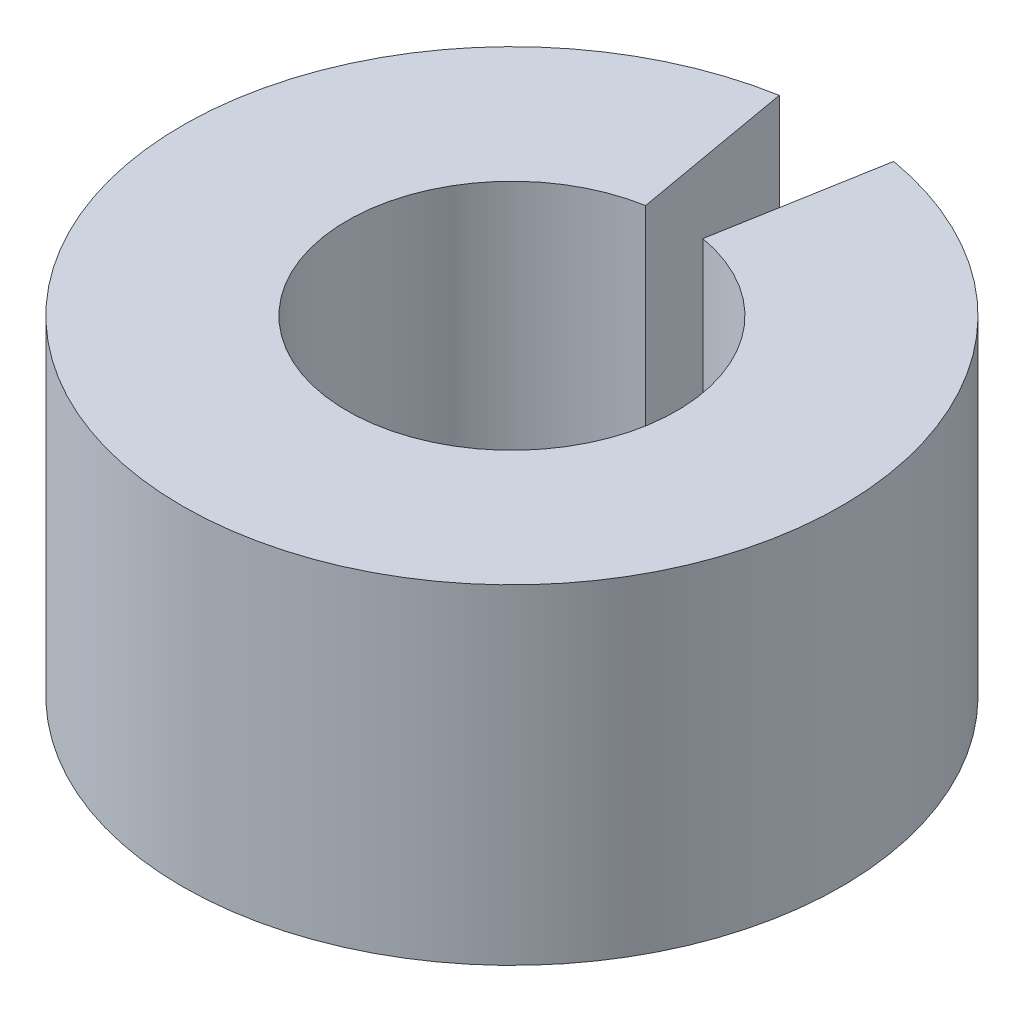
ISO-10303-21;
HEADER;
FILE_DESCRIPTION(('STEP AP214'),'2;1');
FILE_NAME('part.step','',(''),(''),'','','');
FILE_SCHEMA(('AUTOMOTIVE_DESIGN { 1 0 10303 214 1 1 1 1 }'));
ENDSEC;
DATA;
#1=APPLICATION_CONTEXT('core data for automotive mechanical design processes');
#2=APPLICATION_PROTOCOL_DEFINITION('international standard','automotive_design',2000,#1);
#3=PRODUCT_CONTEXT('',#1,'mechanical');
#4=PRODUCT('Part','Part','',(#3));
#5=PRODUCT_RELATED_PRODUCT_CATEGORY('part','',(#4));
#6=PRODUCT_DEFINITION_FORMATION('','',#4);
#7=PRODUCT_DEFINITION_CONTEXT('part definition',#1,'design');
#8=PRODUCT_DEFINITION('design','',#6,#7);
#9=PRODUCT_DEFINITION_SHAPE('','',#8);
#10=(LENGTH_UNIT() NAMED_UNIT(*) SI_UNIT(.MILLI.,.METRE.));
#11=(NAMED_UNIT(*) PLANE_ANGLE_UNIT() SI_UNIT($,.RADIAN.));
#12=(NAMED_UNIT(*) SI_UNIT($,.STERADIAN.) SOLID_ANGLE_UNIT());
#13=UNCERTAINTY_MEASURE_WITH_UNIT(LENGTH_MEASURE(1.E-05),#10,'distance_accuracy_value','');
#14=(GEOMETRIC_REPRESENTATION_CONTEXT(3) GLOBAL_UNCERTAINTY_ASSIGNED_CONTEXT((#13)) GLOBAL_UNIT_ASSIGNED_CONTEXT((#10,
#11,#12)) REPRESENTATION_CONTEXT('',''));
#15=CARTESIAN_POINT('',(0.,0.,0.));
#16=DIRECTION('',(0.,0.,1.));
#17=DIRECTION('',(1.,0.,0.));
#18=AXIS2_PLACEMENT_3D('',#15,#16,#17);
#19=CARTESIAN_POINT('',(0.,1.,0.));
#20=DIRECTION('',(0.,-1.,0.));
#21=DIRECTION('',(0.,0.,-1.));
#22=AXIS2_PLACEMENT_3D('',#19,#20,#21);
#23=CYLINDRICAL_SURFACE('',#22,1.);
#24=CARTESIAN_POINT('',(0.,0.,0.));
#25=DIRECTION('',(0.,1.,0.));
#26=DIRECTION('',(0.,0.,1.));
#27=AXIS2_PLACEMENT_3D('',#24,#25,#26);
#28=CIRCLE('',#27,1.);
#29=CARTESIAN_POINT('',(-0.173648177666931,0.,-0.984807753012208));
#30=VERTEX_POINT('',#29);
#31=CARTESIAN_POINT('',(0.173648177666931,0.,-0.984807753012208));
#32=VERTEX_POINT('',#31);
#33=EDGE_CURVE('E97',#30,#32,#28,.T.);
#34=ORIENTED_EDGE('',*,*,#33,.T.);
#35=DIRECTION('',(0.,-1.,0.));
#36=VECTOR('',#35,1.);
#37=CARTESIAN_POINT('',(0.173648177666931,1.,-0.984807753012208));
#38=LINE('',#37,#36);
#39=CARTESIAN_POINT('',(0.173648177666931,1.,-0.984807753012208));
#40=VERTEX_POINT('',#39);
#41=EDGE_CURVE('E11',#40,#32,#38,.T.);
#42=ORIENTED_EDGE('',*,*,#41,.F.);
#43=CARTESIAN_POINT('',(0.,1.,0.));
#44=DIRECTION('',(0.,1.,0.));
#45=DIRECTION('',(0.,0.,1.));
#46=AXIS2_PLACEMENT_3D('',#43,#44,#45);
#47=CIRCLE('',#46,1.);
#48=CARTESIAN_POINT('',(-0.173648177666931,1.,-0.984807753012208));
#49=VERTEX_POINT('',#48);
#50=EDGE_CURVE('E85',#49,#40,#47,.T.);
#51=ORIENTED_EDGE('',*,*,#50,.F.);
#52=DIRECTION('',(0.,-1.,0.));
#53=VECTOR('',#52,1.);
#54=CARTESIAN_POINT('',(-0.173648177666931,1.,-0.984807753012208));
#55=LINE('',#54,#53);
#56=EDGE_CURVE('E93',#49,#30,#55,.T.);
#57=ORIENTED_EDGE('',*,*,#56,.T.);
#58=EDGE_LOOP('',(#34,#42,#51,#57));
#59=FACE_BOUND('',#58,.T.);
#60=ADVANCED_FACE('F34',(#59),#23,.T.);
#61=CARTESIAN_POINT('',(0.0868240888334654,1.,-0.492403876506104));
#62=DIRECTION('',(0.984807753012208,0.,0.173648177666931));
#63=DIRECTION('',(0.173648177666931,0.,-0.984807753012208));
#64=AXIS2_PLACEMENT_3D('',#61,#62,#63);
#65=PLANE('',#64);
#66=DIRECTION('',(-0.173648177666931,0.,0.984807753012208));
#67=VECTOR('',#66,1.);
#68=CARTESIAN_POINT('',(0.0868240888334654,0.,-0.492403876506104));
#69=LINE('',#68,#67);
#70=CARTESIAN_POINT('',(0.0868240888334654,0.,-0.492403876506104));
#71=VERTEX_POINT('',#70);
#72=EDGE_CURVE('E89',#32,#71,#69,.T.);
#73=ORIENTED_EDGE('',*,*,#72,.T.);
#74=DIRECTION('',(0.,-1.,0.));
#75=VECTOR('',#74,1.);
#76=CARTESIAN_POINT('',(0.0868240888334654,1.,-0.492403876506104));
#77=LINE('',#76,#75);
#78=CARTESIAN_POINT('',(0.0868240888334654,1.,-0.492403876506104));
#79=VERTEX_POINT('',#78);
#80=EDGE_CURVE('E42',#79,#71,#77,.T.);
#81=ORIENTED_EDGE('',*,*,#80,.F.);
#82=DIRECTION('',(-0.173648177666931,0.,0.984807753012208));
#83=VECTOR('',#82,1.);
#84=CARTESIAN_POINT('',(0.0868240888334654,1.,-0.492403876506104));
#85=LINE('',#84,#83);
#86=EDGE_CURVE('E80',#40,#79,#85,.T.);
#87=ORIENTED_EDGE('',*,*,#86,.F.);
#88=ORIENTED_EDGE('',*,*,#41,.T.);
#89=EDGE_LOOP('',(#73,#81,#87,#88));
#90=FACE_BOUND('',#89,.T.);
#91=ADVANCED_FACE('F88',(#90),#65,.F.);
#92=CARTESIAN_POINT('',(0.,1.,0.));
#93=DIRECTION('',(0.,-1.,0.));
#94=DIRECTION('',(0.,0.,-1.));
#95=AXIS2_PLACEMENT_3D('',#92,#93,#94);
#96=CYLINDRICAL_SURFACE('',#95,0.5);
#97=CARTESIAN_POINT('',(0.,0.,0.));
#98=DIRECTION('',(0.,-1.,0.));
#99=DIRECTION('',(0.,0.,1.));
#100=AXIS2_PLACEMENT_3D('',#97,#98,#99);
#101=CIRCLE('',#100,0.5);
#102=CARTESIAN_POINT('',(-0.0868240888334655,0.,-0.492403876506104));
#103=VERTEX_POINT('',#102);
#104=EDGE_CURVE('E67',#71,#103,#101,.T.);
#105=ORIENTED_EDGE('',*,*,#104,.T.);
#106=DIRECTION('',(0.,-1.,0.));
#107=VECTOR('',#106,1.);
#108=CARTESIAN_POINT('',(-0.0868240888334655,1.,-0.492403876506104));
#109=LINE('',#108,#107);
#110=CARTESIAN_POINT('',(-0.0868240888334655,1.,-0.492403876506104));
#111=VERTEX_POINT('',#110);
#112=EDGE_CURVE('E90',#111,#103,#109,.T.);
#113=ORIENTED_EDGE('',*,*,#112,.F.);
#114=CARTESIAN_POINT('',(0.,1.,0.));
#115=DIRECTION('',(0.,-1.,0.));
#116=DIRECTION('',(0.,0.,1.));
#117=AXIS2_PLACEMENT_3D('',#114,#115,#116);
#118=CIRCLE('',#117,0.5);
#119=EDGE_CURVE('E83',#79,#111,#118,.T.);
#120=ORIENTED_EDGE('',*,*,#119,.F.);
#121=ORIENTED_EDGE('',*,*,#80,.T.);
#122=EDGE_LOOP('',(#105,#113,#120,#121));
#123=FACE_BOUND('',#122,.T.);
#124=ADVANCED_FACE('F91',(#123),#96,.F.);
#125=CARTESIAN_POINT('',(-0.0868240888334657,1.,-0.492403876506104));
#126=DIRECTION('',(-0.984807753012208,0.,0.173648177666931));
#127=DIRECTION('',(0.173648177666931,0.,0.984807753012208));
#128=AXIS2_PLACEMENT_3D('',#125,#126,#127);
#129=PLANE('',#128);
#130=DIRECTION('',(-0.173648177666931,0.,-0.984807753012208));
#131=VECTOR('',#130,1.);
#132=CARTESIAN_POINT('',(-0.0868240888334657,0.,-0.492403876506104));
#133=LINE('',#132,#131);
#134=EDGE_CURVE('E73',#103,#30,#133,.T.);
#135=ORIENTED_EDGE('',*,*,#134,.T.);
#136=ORIENTED_EDGE('',*,*,#56,.F.);
#137=DIRECTION('',(-0.173648177666931,0.,-0.984807753012208));
#138=VECTOR('',#137,1.);
#139=CARTESIAN_POINT('',(-0.0868240888334657,1.,-0.492403876506104));
#140=LINE('',#139,#138);
#141=EDGE_CURVE('E50',#111,#49,#140,.T.);
#142=ORIENTED_EDGE('',*,*,#141,.F.);
#143=ORIENTED_EDGE('',*,*,#112,.T.);
#144=EDGE_LOOP('',(#135,#136,#142,#143));
#145=FACE_BOUND('',#144,.T.);
#146=ADVANCED_FACE('F104',(#145),#129,.F.);
#147=CARTESIAN_POINT('',(0.,1.,0.));
#148=DIRECTION('',(0.,1.,0.));
#149=DIRECTION('',(0.,0.,1.));
#150=AXIS2_PLACEMENT_3D('',#147,#148,#149);
#151=PLANE('',#150);
#152=ORIENTED_EDGE('',*,*,#50,.T.);
#153=ORIENTED_EDGE('',*,*,#86,.T.);
#154=ORIENTED_EDGE('',*,*,#119,.T.);
#155=ORIENTED_EDGE('',*,*,#141,.T.);
#156=EDGE_LOOP('',(#152,#153,#154,#155));
#157=FACE_BOUND('',#156,.T.);
#158=ADVANCED_FACE('F81',(#157),#151,.T.);
#159=CARTESIAN_POINT('',(0.,0.,0.));
#160=DIRECTION('',(0.,1.,0.));
#161=DIRECTION('',(0.,0.,1.));
#162=AXIS2_PLACEMENT_3D('',#159,#160,#161);
#163=PLANE('',#162);
#164=ORIENTED_EDGE('',*,*,#33,.F.);
#165=ORIENTED_EDGE('',*,*,#134,.F.);
#166=ORIENTED_EDGE('',*,*,#104,.F.);
#167=ORIENTED_EDGE('',*,*,#72,.F.);
#168=EDGE_LOOP('',(#164,#165,#166,#167));
#169=FACE_BOUND('',#168,.T.);
#170=ADVANCED_FACE('F107',(#169),#163,.F.);
#171=CLOSED_SHELL('',(#60,#91,#124,#146,#158,#170));
#172=MANIFOLD_SOLID_BREP('B2',#171);
#173=ADVANCED_BREP_SHAPE_REPRESENTATION('',(#18,#172),#14);
#174=SHAPE_DEFINITION_REPRESENTATION(#9,#173);
ENDSEC;
END-ISO-10303-21;
